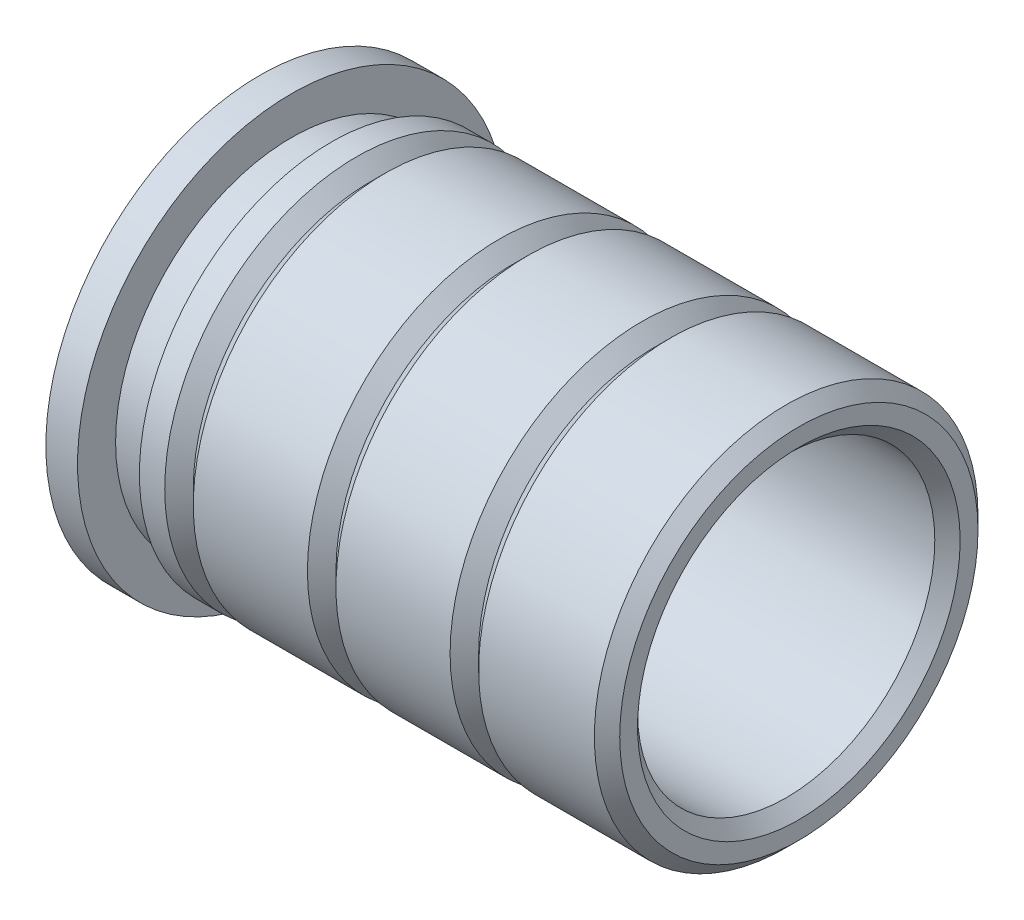
ISO-10303-21;
HEADER;
FILE_DESCRIPTION(('STEP AP214'),'2;1');
FILE_NAME('part.step','',(''),(''),'','','');
FILE_SCHEMA(('AUTOMOTIVE_DESIGN { 1 0 10303 214 1 1 1 1 }'));
ENDSEC;
DATA;
#1=APPLICATION_CONTEXT('core data for automotive mechanical design processes');
#2=APPLICATION_PROTOCOL_DEFINITION('international standard','automotive_design',2000,#1);
#3=PRODUCT_CONTEXT('',#1,'mechanical');
#4=PRODUCT('Part','Part','',(#3));
#5=PRODUCT_RELATED_PRODUCT_CATEGORY('part','',(#4));
#6=PRODUCT_DEFINITION_FORMATION('','',#4);
#7=PRODUCT_DEFINITION_CONTEXT('part definition',#1,'design');
#8=PRODUCT_DEFINITION('design','',#6,#7);
#9=PRODUCT_DEFINITION_SHAPE('','',#8);
#10=(LENGTH_UNIT() NAMED_UNIT(*) SI_UNIT(.MILLI.,.METRE.));
#11=(NAMED_UNIT(*) PLANE_ANGLE_UNIT() SI_UNIT($,.RADIAN.));
#12=(NAMED_UNIT(*) SI_UNIT($,.STERADIAN.) SOLID_ANGLE_UNIT());
#13=UNCERTAINTY_MEASURE_WITH_UNIT(LENGTH_MEASURE(1.E-05),#10,'distance_accuracy_value','');
#14=(GEOMETRIC_REPRESENTATION_CONTEXT(3) GLOBAL_UNCERTAINTY_ASSIGNED_CONTEXT((#13)) GLOBAL_UNIT_ASSIGNED_CONTEXT((#10,
#11,#12)) REPRESENTATION_CONTEXT('',''));
#15=CARTESIAN_POINT('',(0.,0.,0.));
#16=DIRECTION('',(0.,0.,1.));
#17=DIRECTION('',(1.,0.,0.));
#18=AXIS2_PLACEMENT_3D('',#15,#16,#17);
#19=CARTESIAN_POINT('',(0.,0.,0.));
#20=DIRECTION('',(1.,0.,0.));
#21=DIRECTION('',(0.,0.,-1.));
#22=AXIS2_PLACEMENT_3D('',#19,#20,#21);
#23=CYLINDRICAL_SURFACE('',#22,3.0734);
#24=CARTESIAN_POINT('',(6.1214,0.,0.));
#25=DIRECTION('',(-1.,0.,0.));
#26=DIRECTION('',(0.,0.,1.));
#27=AXIS2_PLACEMENT_3D('',#24,#25,#26);
#28=CIRCLE('',#27,3.0734);
#29=CARTESIAN_POINT('',(6.1214,0.,3.0734));
#30=VERTEX_POINT('',#29);
#31=EDGE_CURVE('E44',#30,#30,#28,.F.);
#32=ORIENTED_EDGE('',*,*,#31,.F.);
#33=EDGE_LOOP('',(#32));
#34=FACE_BOUND('',#33,.T.);
#35=CARTESIAN_POINT('',(4.2926,0.,0.));
#36=DIRECTION('',(1.,0.,0.));
#37=DIRECTION('',(0.,0.,-1.));
#38=AXIS2_PLACEMENT_3D('',#35,#36,#37);
#39=CIRCLE('',#38,3.0734);
#40=CARTESIAN_POINT('',(4.2926,0.,-3.0734));
#41=VERTEX_POINT('',#40);
#42=EDGE_CURVE('E65',#41,#41,#39,.F.);
#43=ORIENTED_EDGE('',*,*,#42,.F.);
#44=EDGE_LOOP('',(#43));
#45=FACE_BOUND('',#44,.T.);
#46=ADVANCED_FACE('F39',(#34,#45),#23,.T.);
#47=CARTESIAN_POINT('',(3.8354,0.,0.));
#48=DIRECTION('',(-1.,0.,0.));
#49=DIRECTION('',(0.,0.,1.));
#50=AXIS2_PLACEMENT_3D('',#47,#48,#49);
#51=CIRCLE('',#50,3.0734);
#52=CARTESIAN_POINT('',(3.8354,0.,3.0734));
#53=VERTEX_POINT('',#52);
#54=EDGE_CURVE('E68',#53,#53,#51,.F.);
#55=ORIENTED_EDGE('',*,*,#54,.F.);
#56=EDGE_LOOP('',(#55));
#57=FACE_BOUND('',#56,.T.);
#58=CARTESIAN_POINT('',(2.0066,0.,0.));
#59=DIRECTION('',(1.,0.,0.));
#60=DIRECTION('',(0.,0.,-1.));
#61=AXIS2_PLACEMENT_3D('',#58,#59,#60);
#62=CIRCLE('',#61,3.0734);
#63=CARTESIAN_POINT('',(2.0066,0.,-3.0734));
#64=VERTEX_POINT('',#63);
#65=EDGE_CURVE('E57',#64,#64,#62,.F.);
#66=ORIENTED_EDGE('',*,*,#65,.F.);
#67=EDGE_LOOP('',(#66));
#68=FACE_BOUND('',#67,.T.);
#69=ADVANCED_FACE('F135',(#57,#68),#23,.T.);
#70=CARTESIAN_POINT('',(1.5494,0.,0.));
#71=DIRECTION('',(-1.,0.,0.));
#72=DIRECTION('',(0.,0.,1.));
#73=AXIS2_PLACEMENT_3D('',#70,#71,#72);
#74=CIRCLE('',#73,3.0734);
#75=CARTESIAN_POINT('',(1.5494,0.,3.0734));
#76=VERTEX_POINT('',#75);
#77=EDGE_CURVE('E60',#76,#76,#74,.F.);
#78=ORIENTED_EDGE('',*,*,#77,.F.);
#79=EDGE_LOOP('',(#78));
#80=FACE_BOUND('',#79,.T.);
#81=CARTESIAN_POINT('',(1.143,0.,0.));
#82=DIRECTION('',(1.,0.,0.));
#83=DIRECTION('',(0.,0.,-1.));
#84=AXIS2_PLACEMENT_3D('',#81,#82,#83);
#85=CIRCLE('',#84,3.0734);
#86=CARTESIAN_POINT('',(1.143,0.,-3.0734));
#87=VERTEX_POINT('',#86);
#88=EDGE_CURVE('E64',#87,#87,#85,.T.);
#89=ORIENTED_EDGE('',*,*,#88,.T.);
#90=EDGE_LOOP('',(#89));
#91=FACE_BOUND('',#90,.T.);
#92=ADVANCED_FACE('F142',(#80,#91),#23,.T.);
#93=CARTESIAN_POINT('',(0.,2.38125,0.));
#94=DIRECTION('',(-1.,0.,0.));
#95=DIRECTION('',(0.,0.,1.));
#96=AXIS2_PLACEMENT_3D('',#93,#94,#95);
#97=PLANE('',#96);
#98=CARTESIAN_POINT('',(0.,0.,0.));
#99=DIRECTION('',(-1.,0.,0.));
#100=DIRECTION('',(0.,0.,1.));
#101=AXIS2_PLACEMENT_3D('',#98,#99,#100);
#102=CIRCLE('',#101,2.58445);
#103=CARTESIAN_POINT('',(0.,0.,2.58445));
#104=VERTEX_POINT('',#103);
#105=EDGE_CURVE('E100',#104,#104,#102,.F.);
#106=ORIENTED_EDGE('',*,*,#105,.T.);
#107=EDGE_LOOP('',(#106));
#108=FACE_BOUND('',#107,.T.);
#109=CARTESIAN_POINT('',(0.,0.,0.));
#110=DIRECTION('',(1.,0.,0.));
#111=DIRECTION('',(0.,0.,-1.));
#112=AXIS2_PLACEMENT_3D('',#109,#110,#111);
#113=CIRCLE('',#112,3.429);
#114=CARTESIAN_POINT('',(0.,0.,-3.429));
#115=VERTEX_POINT('',#114);
#116=EDGE_CURVE('E97',#115,#115,#113,.T.);
#117=ORIENTED_EDGE('',*,*,#116,.F.);
#118=EDGE_LOOP('',(#117));
#119=FACE_BOUND('',#118,.T.);
#120=ADVANCED_FACE('F157',(#108,#119),#97,.T.);
#121=CARTESIAN_POINT('',(0.,0.,0.));
#122=DIRECTION('',(1.,0.,0.));
#123=DIRECTION('',(0.,0.,-1.));
#124=AXIS2_PLACEMENT_3D('',#121,#122,#123);
#125=CYLINDRICAL_SURFACE('',#124,3.429);
#126=ORIENTED_EDGE('',*,*,#116,.T.);
#127=EDGE_LOOP('',(#126));
#128=FACE_BOUND('',#127,.T.);
#129=CARTESIAN_POINT('',(0.508,0.,0.));
#130=DIRECTION('',(1.,0.,0.));
#131=DIRECTION('',(0.,0.,-1.));
#132=AXIS2_PLACEMENT_3D('',#129,#130,#131);
#133=CIRCLE('',#132,3.429);
#134=CARTESIAN_POINT('',(0.508,0.,-3.429));
#135=VERTEX_POINT('',#134);
#136=EDGE_CURVE('E94',#135,#135,#133,.T.);
#137=ORIENTED_EDGE('',*,*,#136,.F.);
#138=EDGE_LOOP('',(#137));
#139=FACE_BOUND('',#138,.T.);
#140=ADVANCED_FACE('F163',(#128,#139),#125,.T.);
#141=CARTESIAN_POINT('',(0.508,3.429,0.));
#142=DIRECTION('',(1.,0.,0.));
#143=DIRECTION('',(0.,0.,-1.));
#144=AXIS2_PLACEMENT_3D('',#141,#142,#143);
#145=PLANE('',#144);
#146=ORIENTED_EDGE('',*,*,#136,.T.);
#147=EDGE_LOOP('',(#146));
#148=FACE_BOUND('',#147,.T.);
#149=CARTESIAN_POINT('',(0.508,0.,0.));
#150=DIRECTION('',(1.,0.,0.));
#151=DIRECTION('',(0.,0.,-1.));
#152=AXIS2_PLACEMENT_3D('',#149,#150,#151);
#153=CIRCLE('',#152,2.8194);
#154=CARTESIAN_POINT('',(0.508,0.,-2.8194));
#155=VERTEX_POINT('',#154);
#156=EDGE_CURVE('E91',#155,#155,#153,.T.);
#157=ORIENTED_EDGE('',*,*,#156,.F.);
#158=EDGE_LOOP('',(#157));
#159=FACE_BOUND('',#158,.T.);
#160=ADVANCED_FACE('F283',(#148,#159),#145,.T.);
#161=CARTESIAN_POINT('',(0.,0.,0.));
#162=DIRECTION('',(1.,0.,0.));
#163=DIRECTION('',(0.,0.,-1.));
#164=AXIS2_PLACEMENT_3D('',#161,#162,#163);
#165=CYLINDRICAL_SURFACE('',#164,2.8194);
#166=ORIENTED_EDGE('',*,*,#156,.T.);
#167=EDGE_LOOP('',(#166));
#168=FACE_BOUND('',#167,.T.);
#169=CARTESIAN_POINT('',(1.143,0.,0.));
#170=DIRECTION('',(1.,0.,0.));
#171=DIRECTION('',(0.,0.,-1.));
#172=AXIS2_PLACEMENT_3D('',#169,#170,#171);
#173=CIRCLE('',#172,2.8194);
#174=CARTESIAN_POINT('',(1.143,0.,-2.8194));
#175=VERTEX_POINT('',#174);
#176=EDGE_CURVE('E88',#175,#175,#173,.T.);
#177=ORIENTED_EDGE('',*,*,#176,.F.);
#178=EDGE_LOOP('',(#177));
#179=FACE_BOUND('',#178,.T.);
#180=ADVANCED_FACE('F154',(#168,#179),#165,.T.);
#181=CARTESIAN_POINT('',(1.143,2.8194,0.));
#182=DIRECTION('',(-1.,0.,0.));
#183=DIRECTION('',(0.,0.,1.));
#184=AXIS2_PLACEMENT_3D('',#181,#182,#183);
#185=PLANE('',#184);
#186=ORIENTED_EDGE('',*,*,#176,.T.);
#187=EDGE_LOOP('',(#186));
#188=FACE_BOUND('',#187,.T.);
#189=ORIENTED_EDGE('',*,*,#88,.F.);
#190=EDGE_LOOP('',(#189));
#191=FACE_BOUND('',#190,.T.);
#192=ADVANCED_FACE('F148',(#188,#191),#185,.T.);
#193=CARTESIAN_POINT('',(6.5786,0.,0.));
#194=DIRECTION('',(1.,0.,0.));
#195=DIRECTION('',(0.,0.,-1.));
#196=AXIS2_PLACEMENT_3D('',#193,#194,#195);
#197=CIRCLE('',#196,3.0734);
#198=CARTESIAN_POINT('',(6.5786,0.,-3.0734));
#199=VERTEX_POINT('',#198);
#200=EDGE_CURVE('E71',#199,#199,#197,.F.);
#201=ORIENTED_EDGE('',*,*,#200,.F.);
#202=EDGE_LOOP('',(#201));
#203=FACE_BOUND('',#202,.T.);
#204=CARTESIAN_POINT('',(8.43279999999999,0.,0.));
#205=DIRECTION('',(1.,0.,0.));
#206=DIRECTION('',(0.,0.,-1.));
#207=AXIS2_PLACEMENT_3D('',#204,#205,#206);
#208=CIRCLE('',#207,3.0734);
#209=CARTESIAN_POINT('',(8.43279999999999,0.,-3.0734));
#210=VERTEX_POINT('',#209);
#211=EDGE_CURVE('E10',#210,#210,#208,.F.);
#212=ORIENTED_EDGE('',*,*,#211,.T.);
#213=EDGE_LOOP('',(#212));
#214=FACE_BOUND('',#213,.T.);
#215=ADVANCED_FACE('F130',(#203,#214),#23,.T.);
#216=CARTESIAN_POINT('',(8.636,2.38125,0.));
#217=DIRECTION('',(1.,0.,0.));
#218=DIRECTION('',(0.,0.,-1.));
#219=AXIS2_PLACEMENT_3D('',#216,#217,#218);
#220=PLANE('',#219);
#221=CARTESIAN_POINT('',(8.636,0.,0.));
#222=DIRECTION('',(1.,0.,0.));
#223=DIRECTION('',(0.,0.,-1.));
#224=AXIS2_PLACEMENT_3D('',#221,#222,#223);
#225=CIRCLE('',#224,2.8702);
#226=CARTESIAN_POINT('',(8.636,0.,-2.8702));
#227=VERTEX_POINT('',#226);
#228=EDGE_CURVE('E48',#227,#227,#225,.T.);
#229=ORIENTED_EDGE('',*,*,#228,.T.);
#230=EDGE_LOOP('',(#229));
#231=FACE_BOUND('',#230,.T.);
#232=CARTESIAN_POINT('',(8.636,0.,0.));
#233=DIRECTION('',(1.,0.,0.));
#234=DIRECTION('',(0.,0.,-1.));
#235=AXIS2_PLACEMENT_3D('',#232,#233,#234);
#236=CIRCLE('',#235,2.58445);
#237=CARTESIAN_POINT('',(8.636,0.,-2.58445));
#238=VERTEX_POINT('',#237);
#239=EDGE_CURVE('E53',#238,#238,#236,.F.);
#240=ORIENTED_EDGE('',*,*,#239,.T.);
#241=EDGE_LOOP('',(#240));
#242=FACE_BOUND('',#241,.T.);
#243=ADVANCED_FACE('F111',(#231,#242),#220,.T.);
#244=CARTESIAN_POINT('',(0.,0.,0.));
#245=DIRECTION('',(1.,0.,0.));
#246=DIRECTION('',(0.,0.,-1.));
#247=AXIS2_PLACEMENT_3D('',#244,#245,#246);
#248=CYLINDRICAL_SURFACE('',#247,2.38125);
#249=CARTESIAN_POINT('',(0.203200000000001,0.,0.));
#250=DIRECTION('',(-1.,0.,0.));
#251=DIRECTION('',(0.,0.,1.));
#252=AXIS2_PLACEMENT_3D('',#249,#250,#251);
#253=CIRCLE('',#252,2.38125);
#254=CARTESIAN_POINT('',(0.203200000000001,0.,2.38125));
#255=VERTEX_POINT('',#254);
#256=EDGE_CURVE('E106',#255,#255,#253,.T.);
#257=ORIENTED_EDGE('',*,*,#256,.T.);
#258=EDGE_LOOP('',(#257));
#259=FACE_BOUND('',#258,.T.);
#260=CARTESIAN_POINT('',(8.43279999999999,0.,0.));
#261=DIRECTION('',(1.,0.,0.));
#262=DIRECTION('',(0.,0.,-1.));
#263=AXIS2_PLACEMENT_3D('',#260,#261,#262);
#264=CIRCLE('',#263,2.38125);
#265=CARTESIAN_POINT('',(8.43279999999999,0.,-2.38125));
#266=VERTEX_POINT('',#265);
#267=EDGE_CURVE('E103',#266,#266,#264,.T.);
#268=ORIENTED_EDGE('',*,*,#267,.T.);
#269=EDGE_LOOP('',(#268));
#270=FACE_BOUND('',#269,.T.);
#271=ADVANCED_FACE('F119',(#259,#270),#248,.F.);
#272=CARTESIAN_POINT('',(0.,0.,0.));
#273=DIRECTION('',(-1.,0.,0.));
#274=DIRECTION('',(0.,0.,1.));
#275=AXIS2_PLACEMENT_3D('',#272,#273,#274);
#276=CONICAL_SURFACE('',#275,2.58445,0.785398163397446);
#277=ORIENTED_EDGE('',*,*,#256,.F.);
#278=EDGE_LOOP('',(#277));
#279=FACE_BOUND('',#278,.T.);
#280=ORIENTED_EDGE('',*,*,#105,.F.);
#281=EDGE_LOOP('',(#280));
#282=FACE_BOUND('',#281,.T.);
#283=ADVANCED_FACE('F116',(#279,#282),#276,.F.);
#284=CARTESIAN_POINT('',(8.43279999999999,0.,0.));
#285=DIRECTION('',(1.,0.,0.));
#286=DIRECTION('',(0.,0.,-1.));
#287=AXIS2_PLACEMENT_3D('',#284,#285,#286);
#288=CONICAL_SURFACE('',#287,2.38125,0.785398163397447);
#289=ORIENTED_EDGE('',*,*,#239,.F.);
#290=EDGE_LOOP('',(#289));
#291=FACE_BOUND('',#290,.T.);
#292=ORIENTED_EDGE('',*,*,#267,.F.);
#293=EDGE_LOOP('',(#292));
#294=FACE_BOUND('',#293,.T.);
#295=ADVANCED_FACE('F113',(#291,#294),#288,.F.);
#296=CARTESIAN_POINT('',(8.636,0.,0.));
#297=DIRECTION('',(-1.,0.,0.));
#298=DIRECTION('',(0.,0.,1.));
#299=AXIS2_PLACEMENT_3D('',#296,#297,#298);
#300=CONICAL_SURFACE('',#299,2.8702,0.785398163397443);
#301=ORIENTED_EDGE('',*,*,#211,.F.);
#302=EDGE_LOOP('',(#301));
#303=FACE_BOUND('',#302,.T.);
#304=ORIENTED_EDGE('',*,*,#228,.F.);
#305=EDGE_LOOP('',(#304));
#306=FACE_BOUND('',#305,.T.);
#307=ADVANCED_FACE('F42',(#303,#306),#300,.T.);
#308=CARTESIAN_POINT('',(1.26227668625154,0.,0.));
#309=DIRECTION('',(-1.,0.,0.));
#310=DIRECTION('',(0.,0.,1.));
#311=AXIS2_PLACEMENT_3D('',#308,#309,#310);
#312=CONICAL_SURFACE('',#311,3.36052331374846,0.785398163397454);
#313=ORIENTED_EDGE('',*,*,#77,.T.);
#314=EDGE_LOOP('',(#313));
#315=FACE_BOUND('',#314,.T.);
#316=CARTESIAN_POINT('',(1.778,0.,0.));
#317=DIRECTION('',(1.,0.,0.));
#318=DIRECTION('',(0.,0.,-1.));
#319=AXIS2_PLACEMENT_3D('',#316,#317,#318);
#320=CIRCLE('',#319,2.8448);
#321=CARTESIAN_POINT('',(1.778,0.,-2.8448));
#322=VERTEX_POINT('',#321);
#323=EDGE_CURVE('E61',#322,#322,#320,.T.);
#324=ORIENTED_EDGE('',*,*,#323,.F.);
#325=EDGE_LOOP('',(#324));
#326=FACE_BOUND('',#325,.T.);
#327=ADVANCED_FACE('F171',(#315,#326),#312,.T.);
#328=CARTESIAN_POINT('',(1.778,0.,0.));
#329=DIRECTION('',(1.,0.,0.));
#330=DIRECTION('',(0.,0.,-1.));
#331=AXIS2_PLACEMENT_3D('',#328,#329,#330);
#332=CONICAL_SURFACE('',#331,2.8448,0.785398163397447);
#333=ORIENTED_EDGE('',*,*,#65,.T.);
#334=EDGE_LOOP('',(#333));
#335=FACE_BOUND('',#334,.T.);
#336=ORIENTED_EDGE('',*,*,#323,.T.);
#337=EDGE_LOOP('',(#336));
#338=FACE_BOUND('',#337,.T.);
#339=ADVANCED_FACE('F173',(#335,#338),#332,.T.);
#340=CARTESIAN_POINT('',(3.54827668625154,0.,0.));
#341=DIRECTION('',(-1.,0.,0.));
#342=DIRECTION('',(0.,0.,1.));
#343=AXIS2_PLACEMENT_3D('',#340,#341,#342);
#344=CONICAL_SURFACE('',#343,3.36052331374846,0.785398163397454);
#345=ORIENTED_EDGE('',*,*,#54,.T.);
#346=EDGE_LOOP('',(#345));
#347=FACE_BOUND('',#346,.T.);
#348=CARTESIAN_POINT('',(4.064,0.,0.));
#349=DIRECTION('',(1.,0.,0.));
#350=DIRECTION('',(0.,0.,-1.));
#351=AXIS2_PLACEMENT_3D('',#348,#349,#350);
#352=CIRCLE('',#351,2.8448);
#353=CARTESIAN_POINT('',(4.064,0.,-2.8448));
#354=VERTEX_POINT('',#353);
#355=EDGE_CURVE('E69',#354,#354,#352,.T.);
#356=ORIENTED_EDGE('',*,*,#355,.F.);
#357=EDGE_LOOP('',(#356));
#358=FACE_BOUND('',#357,.T.);
#359=ADVANCED_FACE('F176',(#347,#358),#344,.T.);
#360=CARTESIAN_POINT('',(4.064,0.,0.));
#361=DIRECTION('',(1.,0.,0.));
#362=DIRECTION('',(0.,0.,-1.));
#363=AXIS2_PLACEMENT_3D('',#360,#361,#362);
#364=CONICAL_SURFACE('',#363,2.8448,0.785398163397447);
#365=ORIENTED_EDGE('',*,*,#42,.T.);
#366=EDGE_LOOP('',(#365));
#367=FACE_BOUND('',#366,.T.);
#368=ORIENTED_EDGE('',*,*,#355,.T.);
#369=EDGE_LOOP('',(#368));
#370=FACE_BOUND('',#369,.T.);
#371=ADVANCED_FACE('F181',(#367,#370),#364,.T.);
#372=CARTESIAN_POINT('',(5.83427668625154,0.,0.));
#373=DIRECTION('',(-1.,0.,0.));
#374=DIRECTION('',(0.,0.,1.));
#375=AXIS2_PLACEMENT_3D('',#372,#373,#374);
#376=CONICAL_SURFACE('',#375,3.36052331374846,0.785398163397454);
#377=ORIENTED_EDGE('',*,*,#31,.T.);
#378=EDGE_LOOP('',(#377));
#379=FACE_BOUND('',#378,.T.);
#380=CARTESIAN_POINT('',(6.35,0.,0.));
#381=DIRECTION('',(1.,0.,0.));
#382=DIRECTION('',(0.,0.,-1.));
#383=AXIS2_PLACEMENT_3D('',#380,#381,#382);
#384=CIRCLE('',#383,2.8448);
#385=CARTESIAN_POINT('',(6.35,0.,-2.8448));
#386=VERTEX_POINT('',#385);
#387=EDGE_CURVE('E73',#386,#386,#384,.T.);
#388=ORIENTED_EDGE('',*,*,#387,.F.);
#389=EDGE_LOOP('',(#388));
#390=FACE_BOUND('',#389,.T.);
#391=ADVANCED_FACE('F187',(#379,#390),#376,.T.);
#392=CARTESIAN_POINT('',(6.35,0.,0.));
#393=DIRECTION('',(1.,0.,0.));
#394=DIRECTION('',(0.,0.,-1.));
#395=AXIS2_PLACEMENT_3D('',#392,#393,#394);
#396=CONICAL_SURFACE('',#395,2.8448,0.785398163397447);
#397=ORIENTED_EDGE('',*,*,#200,.T.);
#398=EDGE_LOOP('',(#397));
#399=FACE_BOUND('',#398,.T.);
#400=ORIENTED_EDGE('',*,*,#387,.T.);
#401=EDGE_LOOP('',(#400));
#402=FACE_BOUND('',#401,.T.);
#403=ADVANCED_FACE('F191',(#399,#402),#396,.T.);
#404=CLOSED_SHELL('',(#46,#69,#92,#120,#140,#160,#180,#192,#215,#243,#271,#283,#295,#307,#327,
#339,#359,#371,#391,#403));
#405=MANIFOLD_SOLID_BREP('B2',#404);
#406=ADVANCED_BREP_SHAPE_REPRESENTATION('',(#18,#405),#14);
#407=SHAPE_DEFINITION_REPRESENTATION(#9,#406);
ENDSEC;
END-ISO-10303-21;
